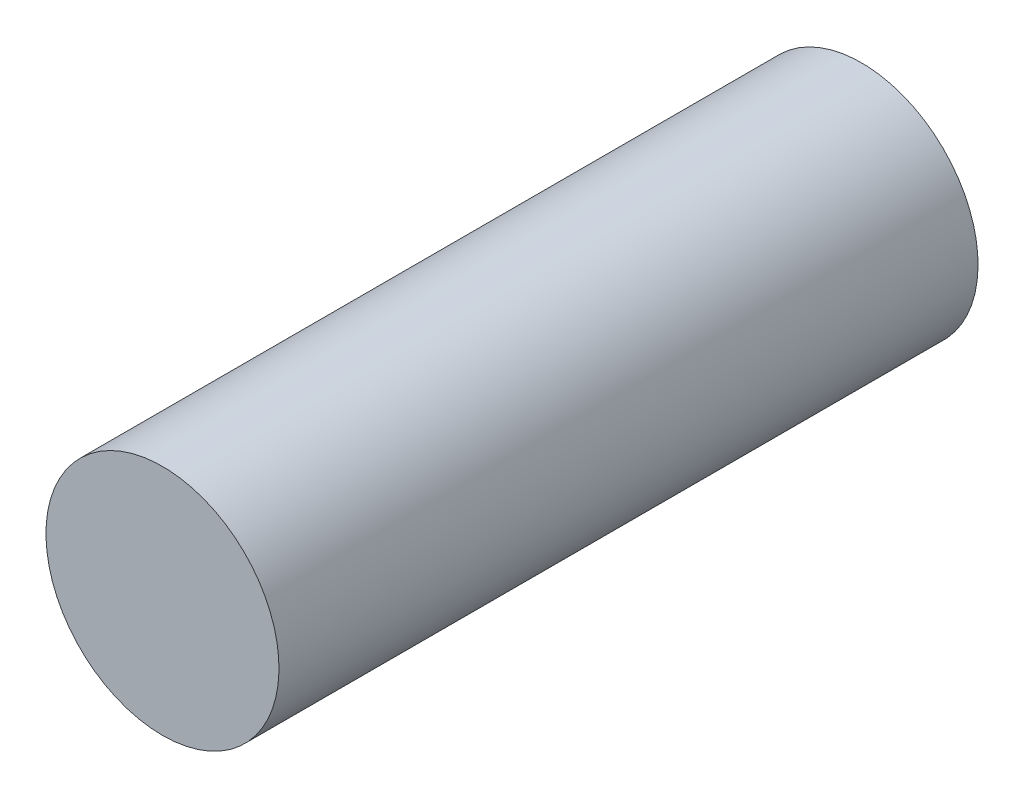
ISO-10303-21;
HEADER;
FILE_DESCRIPTION(('STEP AP214'),'2;1');
FILE_NAME('part.step','',(''),(''),'','','');
FILE_SCHEMA(('AUTOMOTIVE_DESIGN { 1 0 10303 214 1 1 1 1 }'));
ENDSEC;
DATA;
#1=APPLICATION_CONTEXT('core data for automotive mechanical design processes');
#2=APPLICATION_PROTOCOL_DEFINITION('international standard','automotive_design',2000,#1);
#3=PRODUCT_CONTEXT('',#1,'mechanical');
#4=PRODUCT('Part','Part','',(#3));
#5=PRODUCT_RELATED_PRODUCT_CATEGORY('part','',(#4));
#6=PRODUCT_DEFINITION_FORMATION('','',#4);
#7=PRODUCT_DEFINITION_CONTEXT('part definition',#1,'design');
#8=PRODUCT_DEFINITION('design','',#6,#7);
#9=PRODUCT_DEFINITION_SHAPE('','',#8);
#10=(LENGTH_UNIT() NAMED_UNIT(*) SI_UNIT(.MILLI.,.METRE.));
#11=(NAMED_UNIT(*) PLANE_ANGLE_UNIT() SI_UNIT($,.RADIAN.));
#12=(NAMED_UNIT(*) SI_UNIT($,.STERADIAN.) SOLID_ANGLE_UNIT());
#13=UNCERTAINTY_MEASURE_WITH_UNIT(LENGTH_MEASURE(1.E-05),#10,'distance_accuracy_value','');
#14=(GEOMETRIC_REPRESENTATION_CONTEXT(3) GLOBAL_UNCERTAINTY_ASSIGNED_CONTEXT((#13)) GLOBAL_UNIT_ASSIGNED_CONTEXT((#10,
#11,#12)) REPRESENTATION_CONTEXT('',''));
#15=CARTESIAN_POINT('',(0.,0.,0.));
#16=DIRECTION('',(0.,0.,1.));
#17=DIRECTION('',(1.,0.,0.));
#18=AXIS2_PLACEMENT_3D('',#15,#16,#17);
#19=CARTESIAN_POINT('',(-89.983524122,119.935664319,191.395835258));
#20=DIRECTION('',(0.,0.,1.));
#21=DIRECTION('',(1.,0.,0.));
#22=AXIS2_PLACEMENT_3D('',#19,#20,#21);
#23=PLANE('',#22);
#24=CARTESIAN_POINT('',(-83.557324122,126.361864319,191.395835258));
#25=DIRECTION('',(0.,0.,1.));
#26=DIRECTION('',(0.,-1.,0.));
#27=AXIS2_PLACEMENT_3D('',#24,#25,#26);
#28=CIRCLE('',#27,6.34999999999999);
#29=CARTESIAN_POINT('',(-83.557324122,120.011864319,191.395835258));
#30=VERTEX_POINT('',#29);
#31=EDGE_CURVE('E18',#30,#30,#28,.T.);
#32=ORIENTED_EDGE('',*,*,#31,.T.);
#33=EDGE_LOOP('',(#32));
#34=FACE_BOUND('',#33,.T.);
#35=ADVANCED_FACE('F14',(#34),#23,.T.);
#36=CARTESIAN_POINT('',(-89.983524122,119.935664319,153.295835258));
#37=DIRECTION('',(0.,0.,1.));
#38=DIRECTION('',(1.,0.,0.));
#39=AXIS2_PLACEMENT_3D('',#36,#37,#38);
#40=PLANE('',#39);
#41=CARTESIAN_POINT('',(-83.557324122,126.361864319,153.295835258));
#42=DIRECTION('',(0.,0.,1.));
#43=DIRECTION('',(0.,-1.,0.));
#44=AXIS2_PLACEMENT_3D('',#41,#42,#43);
#45=CIRCLE('',#44,6.34999999999999);
#46=CARTESIAN_POINT('',(-83.557324122,120.011864319,153.295835258));
#47=VERTEX_POINT('',#46);
#48=EDGE_CURVE('E10',#47,#47,#45,.F.);
#49=ORIENTED_EDGE('',*,*,#48,.T.);
#50=EDGE_LOOP('',(#49));
#51=FACE_BOUND('',#50,.T.);
#52=ADVANCED_FACE('F16',(#51),#40,.F.);
#53=CARTESIAN_POINT('',(-83.557324122,126.361864319,153.295835258));
#54=DIRECTION('',(0.,0.,1.));
#55=DIRECTION('',(0.,-1.,0.));
#56=AXIS2_PLACEMENT_3D('',#53,#54,#55);
#57=CYLINDRICAL_SURFACE('',#56,6.34999999999999);
#58=ORIENTED_EDGE('',*,*,#31,.F.);
#59=EDGE_LOOP('',(#58));
#60=FACE_BOUND('',#59,.T.);
#61=ORIENTED_EDGE('',*,*,#48,.F.);
#62=EDGE_LOOP('',(#61));
#63=FACE_BOUND('',#62,.T.);
#64=ADVANCED_FACE('F28',(#60,#63),#57,.T.);
#65=CLOSED_SHELL('',(#35,#52,#64));
#66=MANIFOLD_SOLID_BREP('B1',#65);
#67=ADVANCED_BREP_SHAPE_REPRESENTATION('',(#18,#66),#14);
#68=SHAPE_DEFINITION_REPRESENTATION(#9,#67);
ENDSEC;
END-ISO-10303-21;
